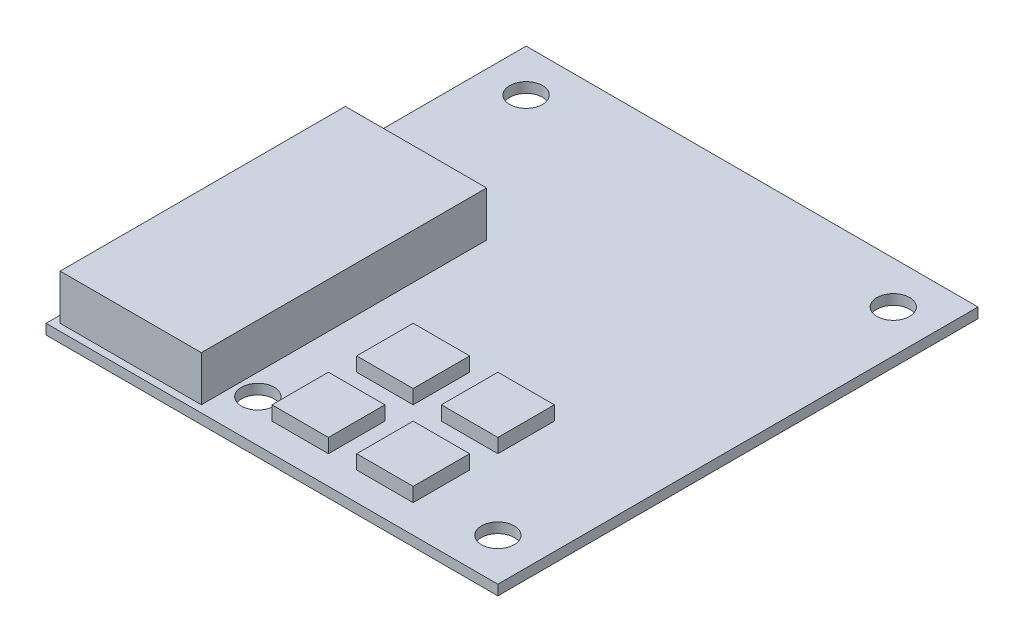
ISO-10303-21;
HEADER;
FILE_DESCRIPTION(('STEP AP214'),'2;1');
FILE_NAME('part.step','',(''),(''),'','','');
FILE_SCHEMA(('AUTOMOTIVE_DESIGN { 1 0 10303 214 1 1 1 1 }'));
ENDSEC;
DATA;
#1=APPLICATION_CONTEXT('core data for automotive mechanical design processes');
#2=APPLICATION_PROTOCOL_DEFINITION('international standard','automotive_design',2000,#1);
#3=PRODUCT_CONTEXT('',#1,'mechanical');
#4=PRODUCT('Part','Part','',(#3));
#5=PRODUCT_RELATED_PRODUCT_CATEGORY('part','',(#4));
#6=PRODUCT_DEFINITION_FORMATION('','',#4);
#7=PRODUCT_DEFINITION_CONTEXT('part definition',#1,'design');
#8=PRODUCT_DEFINITION('design','',#6,#7);
#9=PRODUCT_DEFINITION_SHAPE('','',#8);
#10=(LENGTH_UNIT() NAMED_UNIT(*) SI_UNIT(.MILLI.,.METRE.));
#11=(NAMED_UNIT(*) PLANE_ANGLE_UNIT() SI_UNIT($,.RADIAN.));
#12=(NAMED_UNIT(*) SI_UNIT($,.STERADIAN.) SOLID_ANGLE_UNIT());
#13=UNCERTAINTY_MEASURE_WITH_UNIT(LENGTH_MEASURE(1.E-05),#10,'distance_accuracy_value','');
#14=(GEOMETRIC_REPRESENTATION_CONTEXT(3) GLOBAL_UNCERTAINTY_ASSIGNED_CONTEXT((#13)) GLOBAL_UNIT_ASSIGNED_CONTEXT((#10,
#11,#12)) REPRESENTATION_CONTEXT('',''));
#15=CARTESIAN_POINT('',(0.,0.,0.));
#16=DIRECTION('',(0.,0.,1.));
#17=DIRECTION('',(1.,0.,0.));
#18=AXIS2_PLACEMENT_3D('',#15,#16,#17);
#19=CARTESIAN_POINT('',(0.,0.9144,0.));
#20=DIRECTION('',(0.,-1.,0.));
#21=DIRECTION('',(0.,0.,-1.));
#22=AXIS2_PLACEMENT_3D('',#19,#20,#21);
#23=PLANE('',#22);
#24=CARTESIAN_POINT('',(3.81,0.9144,-39.37));
#25=DIRECTION('',(0.,1.,0.));
#26=DIRECTION('',(0.,0.,1.));
#27=AXIS2_PLACEMENT_3D('',#24,#25,#26);
#28=CIRCLE('',#27,1.4732);
#29=CARTESIAN_POINT('',(3.81,0.9144,-37.8968));
#30=VERTEX_POINT('',#29);
#31=EDGE_CURVE('E396',#30,#30,#28,.T.);
#32=ORIENTED_EDGE('',*,*,#31,.F.);
#33=EDGE_LOOP('',(#32));
#34=FACE_BOUND('',#33,.T.);
#35=CARTESIAN_POINT('',(36.83,0.9144,-39.37));
#36=DIRECTION('',(0.,1.,0.));
#37=DIRECTION('',(0.,0.,1.));
#38=AXIS2_PLACEMENT_3D('',#35,#36,#37);
#39=CIRCLE('',#38,1.47319999999999);
#40=CARTESIAN_POINT('',(36.83,0.9144,-37.8968));
#41=VERTEX_POINT('',#40);
#42=EDGE_CURVE('E386',#41,#41,#39,.T.);
#43=ORIENTED_EDGE('',*,*,#42,.F.);
#44=EDGE_LOOP('',(#43));
#45=FACE_BOUND('',#44,.T.);
#46=CARTESIAN_POINT('',(36.83,0.9144,-3.81));
#47=DIRECTION('',(0.,1.,0.));
#48=DIRECTION('',(0.,0.,1.));
#49=AXIS2_PLACEMENT_3D('',#46,#47,#48);
#50=CIRCLE('',#49,1.47319999999999);
#51=CARTESIAN_POINT('',(36.83,0.9144,-2.33680000000001));
#52=VERTEX_POINT('',#51);
#53=EDGE_CURVE('E383',#52,#52,#50,.T.);
#54=ORIENTED_EDGE('',*,*,#53,.F.);
#55=EDGE_LOOP('',(#54));
#56=FACE_BOUND('',#55,.T.);
#57=CARTESIAN_POINT('',(15.24,0.9144,-3.81));
#58=DIRECTION('',(0.,1.,0.));
#59=DIRECTION('',(0.,0.,1.));
#60=AXIS2_PLACEMENT_3D('',#57,#58,#59);
#61=CIRCLE('',#60,1.4732);
#62=CARTESIAN_POINT('',(15.24,0.9144,-2.3368));
#63=VERTEX_POINT('',#62);
#64=EDGE_CURVE('E382',#63,#63,#61,.T.);
#65=ORIENTED_EDGE('',*,*,#64,.F.);
#66=EDGE_LOOP('',(#65));
#67=FACE_BOUND('',#66,.T.);
#68=DIRECTION('',(-1.,0.,0.));
#69=VECTOR('',#68,1.);
#70=CARTESIAN_POINT('',(17.78,0.9144,-7.62000000000001));
#71=LINE('',#70,#69);
#72=CARTESIAN_POINT('',(22.86,0.9144,-7.62000000000001));
#73=VERTEX_POINT('',#72);
#74=CARTESIAN_POINT('',(17.78,0.9144,-7.62000000000001));
#75=VERTEX_POINT('',#74);
#76=EDGE_CURVE('E217',#73,#75,#71,.T.);
#77=ORIENTED_EDGE('',*,*,#76,.F.);
#78=DIRECTION('',(0.,0.,-1.));
#79=VECTOR('',#78,1.);
#80=CARTESIAN_POINT('',(22.86,0.9144,-2.54000000000001));
#81=LINE('',#80,#79);
#82=CARTESIAN_POINT('',(22.86,0.9144,-2.54000000000001));
#83=VERTEX_POINT('',#82);
#84=EDGE_CURVE('E230',#83,#73,#81,.T.);
#85=ORIENTED_EDGE('',*,*,#84,.F.);
#86=DIRECTION('',(1.,0.,0.));
#87=VECTOR('',#86,1.);
#88=CARTESIAN_POINT('',(17.78,0.9144,-2.54000000000001));
#89=LINE('',#88,#87);
#90=CARTESIAN_POINT('',(17.78,0.9144,-2.54000000000001));
#91=VERTEX_POINT('',#90);
#92=EDGE_CURVE('E239',#91,#83,#89,.T.);
#93=ORIENTED_EDGE('',*,*,#92,.F.);
#94=DIRECTION('',(0.,0.,1.));
#95=VECTOR('',#94,1.);
#96=CARTESIAN_POINT('',(17.78,0.9144,-2.54000000000001));
#97=LINE('',#96,#95);
#98=EDGE_CURVE('E220',#75,#91,#97,.T.);
#99=ORIENTED_EDGE('',*,*,#98,.F.);
#100=EDGE_LOOP('',(#77,#85,#93,#99));
#101=FACE_BOUND('',#100,.T.);
#102=DIRECTION('',(-1.,0.,0.));
#103=VECTOR('',#102,1.);
#104=CARTESIAN_POINT('',(25.4,0.9144,-15.24));
#105=LINE('',#104,#103);
#106=CARTESIAN_POINT('',(30.48,0.9144,-15.24));
#107=VERTEX_POINT('',#106);
#108=CARTESIAN_POINT('',(25.4,0.9144,-15.24));
#109=VERTEX_POINT('',#108);
#110=EDGE_CURVE('E288',#107,#109,#105,.T.);
#111=ORIENTED_EDGE('',*,*,#110,.F.);
#112=DIRECTION('',(0.,0.,-1.));
#113=VECTOR('',#112,1.);
#114=CARTESIAN_POINT('',(30.48,0.9144,-10.16));
#115=LINE('',#114,#113);
#116=CARTESIAN_POINT('',(30.48,0.9144,-10.16));
#117=VERTEX_POINT('',#116);
#118=EDGE_CURVE('E293',#117,#107,#115,.T.);
#119=ORIENTED_EDGE('',*,*,#118,.F.);
#120=DIRECTION('',(1.,0.,0.));
#121=VECTOR('',#120,1.);
#122=CARTESIAN_POINT('',(25.4,0.9144,-10.16));
#123=LINE('',#122,#121);
#124=CARTESIAN_POINT('',(25.4,0.9144,-10.16));
#125=VERTEX_POINT('',#124);
#126=EDGE_CURVE('E305',#125,#117,#123,.T.);
#127=ORIENTED_EDGE('',*,*,#126,.F.);
#128=DIRECTION('',(0.,0.,1.));
#129=VECTOR('',#128,1.);
#130=CARTESIAN_POINT('',(25.4,0.9144,-10.16));
#131=LINE('',#130,#129);
#132=EDGE_CURVE('E302',#109,#125,#131,.T.);
#133=ORIENTED_EDGE('',*,*,#132,.F.);
#134=EDGE_LOOP('',(#111,#119,#127,#133));
#135=FACE_BOUND('',#134,.T.);
#136=DIRECTION('',(0.,0.,1.));
#137=VECTOR('',#136,1.);
#138=CARTESIAN_POINT('',(0.,0.9144,0.));
#139=LINE('',#138,#137);
#140=CARTESIAN_POINT('',(0.,0.9144,-43.18));
#141=VERTEX_POINT('',#140);
#142=CARTESIAN_POINT('',(0.,0.9144,0.));
#143=VERTEX_POINT('',#142);
#144=EDGE_CURVE('E355',#141,#143,#139,.T.);
#145=ORIENTED_EDGE('',*,*,#144,.T.);
#146=DIRECTION('',(1.,0.,0.));
#147=VECTOR('',#146,1.);
#148=CARTESIAN_POINT('',(0.,0.9144,0.));
#149=LINE('',#148,#147);
#150=CARTESIAN_POINT('',(40.64,0.9144,0.));
#151=VERTEX_POINT('',#150);
#152=EDGE_CURVE('E358',#143,#151,#149,.T.);
#153=ORIENTED_EDGE('',*,*,#152,.T.);
#154=DIRECTION('',(0.,0.,-1.));
#155=VECTOR('',#154,1.);
#156=CARTESIAN_POINT('',(40.64,0.9144,0.));
#157=LINE('',#156,#155);
#158=CARTESIAN_POINT('',(40.64,0.9144,-43.18));
#159=VERTEX_POINT('',#158);
#160=EDGE_CURVE('E361',#151,#159,#157,.T.);
#161=ORIENTED_EDGE('',*,*,#160,.T.);
#162=DIRECTION('',(-1.,0.,0.));
#163=VECTOR('',#162,1.);
#164=CARTESIAN_POINT('',(0.,0.9144,-43.18));
#165=LINE('',#164,#163);
#166=EDGE_CURVE('E363',#159,#141,#165,.T.);
#167=ORIENTED_EDGE('',*,*,#166,.T.);
#168=EDGE_LOOP('',(#145,#153,#161,#167));
#169=FACE_BOUND('',#168,.T.);
#170=DIRECTION('',(0.,0.,-1.));
#171=VECTOR('',#170,1.);
#172=CARTESIAN_POINT('',(22.86,0.9144,-10.16));
#173=LINE('',#172,#171);
#174=CARTESIAN_POINT('',(22.86,0.9144,-10.16));
#175=VERTEX_POINT('',#174);
#176=CARTESIAN_POINT('',(22.86,0.9144,-15.24));
#177=VERTEX_POINT('',#176);
#178=EDGE_CURVE('E321',#175,#177,#173,.T.);
#179=ORIENTED_EDGE('',*,*,#178,.F.);
#180=DIRECTION('',(1.,0.,0.));
#181=VECTOR('',#180,1.);
#182=CARTESIAN_POINT('',(17.78,0.9144,-10.16));
#183=LINE('',#182,#181);
#184=CARTESIAN_POINT('',(17.78,0.9144,-10.16));
#185=VERTEX_POINT('',#184);
#186=EDGE_CURVE('E326',#185,#175,#183,.T.);
#187=ORIENTED_EDGE('',*,*,#186,.F.);
#188=DIRECTION('',(0.,0.,1.));
#189=VECTOR('',#188,1.);
#190=CARTESIAN_POINT('',(17.78,0.9144,-10.16));
#191=LINE('',#190,#189);
#192=CARTESIAN_POINT('',(17.78,0.9144,-15.24));
#193=VERTEX_POINT('',#192);
#194=EDGE_CURVE('E338',#193,#185,#191,.T.);
#195=ORIENTED_EDGE('',*,*,#194,.F.);
#196=DIRECTION('',(-1.,0.,0.));
#197=VECTOR('',#196,1.);
#198=CARTESIAN_POINT('',(17.78,0.9144,-15.24));
#199=LINE('',#198,#197);
#200=EDGE_CURVE('E335',#177,#193,#199,.T.);
#201=ORIENTED_EDGE('',*,*,#200,.F.);
#202=EDGE_LOOP('',(#179,#187,#195,#201));
#203=FACE_BOUND('',#202,.T.);
#204=DIRECTION('',(-1.,0.,0.));
#205=VECTOR('',#204,1.);
#206=CARTESIAN_POINT('',(25.4,0.9144,-7.62000000000001));
#207=LINE('',#206,#205);
#208=CARTESIAN_POINT('',(30.48,0.9144,-7.62000000000001));
#209=VERTEX_POINT('',#208);
#210=CARTESIAN_POINT('',(25.4,0.9144,-7.62000000000001));
#211=VERTEX_POINT('',#210);
#212=EDGE_CURVE('E255',#209,#211,#207,.T.);
#213=ORIENTED_EDGE('',*,*,#212,.F.);
#214=DIRECTION('',(0.,0.,-1.));
#215=VECTOR('',#214,1.);
#216=CARTESIAN_POINT('',(30.48,0.9144,-2.54000000000001));
#217=LINE('',#216,#215);
#218=CARTESIAN_POINT('',(30.48,0.9144,-2.54000000000001));
#219=VERTEX_POINT('',#218);
#220=EDGE_CURVE('E260',#219,#209,#217,.T.);
#221=ORIENTED_EDGE('',*,*,#220,.F.);
#222=DIRECTION('',(1.,0.,0.));
#223=VECTOR('',#222,1.);
#224=CARTESIAN_POINT('',(25.4,0.9144,-2.54000000000001));
#225=LINE('',#224,#223);
#226=CARTESIAN_POINT('',(25.4,0.9144,-2.54000000000001));
#227=VERTEX_POINT('',#226);
#228=EDGE_CURVE('E272',#227,#219,#225,.T.);
#229=ORIENTED_EDGE('',*,*,#228,.F.);
#230=DIRECTION('',(0.,0.,1.));
#231=VECTOR('',#230,1.);
#232=CARTESIAN_POINT('',(25.4,0.9144,-2.54000000000001));
#233=LINE('',#232,#231);
#234=EDGE_CURVE('E269',#211,#227,#233,.T.);
#235=ORIENTED_EDGE('',*,*,#234,.F.);
#236=EDGE_LOOP('',(#213,#221,#229,#235));
#237=FACE_BOUND('',#236,.T.);
#238=DIRECTION('',(0.,0.,1.));
#239=VECTOR('',#238,1.);
#240=CARTESIAN_POINT('',(0.635,0.9144,-0.635));
#241=LINE('',#240,#239);
#242=CARTESIAN_POINT('',(0.635,0.9144,-26.289));
#243=VERTEX_POINT('',#242);
#244=CARTESIAN_POINT('',(0.635,0.9144,-0.635));
#245=VERTEX_POINT('',#244);
#246=EDGE_CURVE('E216',#243,#245,#241,.T.);
#247=ORIENTED_EDGE('',*,*,#246,.F.);
#248=DIRECTION('',(-1.,0.,0.));
#249=VECTOR('',#248,1.);
#250=CARTESIAN_POINT('',(0.635,0.9144,-26.289));
#251=LINE('',#250,#249);
#252=CARTESIAN_POINT('',(13.335,0.9144,-26.289));
#253=VERTEX_POINT('',#252);
#254=EDGE_CURVE('E213',#253,#243,#251,.T.);
#255=ORIENTED_EDGE('',*,*,#254,.F.);
#256=DIRECTION('',(0.,0.,-1.));
#257=VECTOR('',#256,1.);
#258=CARTESIAN_POINT('',(13.335,0.9144,-0.635));
#259=LINE('',#258,#257);
#260=CARTESIAN_POINT('',(13.335,0.9144,-0.635));
#261=VERTEX_POINT('',#260);
#262=EDGE_CURVE('E55',#261,#253,#259,.T.);
#263=ORIENTED_EDGE('',*,*,#262,.F.);
#264=DIRECTION('',(1.,0.,0.));
#265=VECTOR('',#264,1.);
#266=CARTESIAN_POINT('',(0.635,0.9144,-0.635));
#267=LINE('',#266,#265);
#268=EDGE_CURVE('E50',#245,#261,#267,.T.);
#269=ORIENTED_EDGE('',*,*,#268,.F.);
#270=EDGE_LOOP('',(#247,#255,#263,#269));
#271=FACE_BOUND('',#270,.T.);
#272=ADVANCED_FACE('F33',(#34,#45,#56,#67,#101,#135,#169,#203,#237,#271),#23,.F.);
#273=CARTESIAN_POINT('',(0.,0.9144,0.));
#274=DIRECTION('',(1.,0.,0.));
#275=DIRECTION('',(0.,0.,-1.));
#276=AXIS2_PLACEMENT_3D('',#273,#274,#275);
#277=PLANE('',#276);
#278=DIRECTION('',(0.,0.,1.));
#279=VECTOR('',#278,1.);
#280=CARTESIAN_POINT('',(0.,0.,0.));
#281=LINE('',#280,#279);
#282=CARTESIAN_POINT('',(0.,0.,-43.18));
#283=VERTEX_POINT('',#282);
#284=CARTESIAN_POINT('',(0.,0.,0.));
#285=VERTEX_POINT('',#284);
#286=EDGE_CURVE('E354',#283,#285,#281,.T.);
#287=ORIENTED_EDGE('',*,*,#286,.T.);
#288=DIRECTION('',(0.,-1.,0.));
#289=VECTOR('',#288,1.);
#290=CARTESIAN_POINT('',(0.,0.9144,0.));
#291=LINE('',#290,#289);
#292=EDGE_CURVE('E11',#143,#285,#291,.T.);
#293=ORIENTED_EDGE('',*,*,#292,.F.);
#294=ORIENTED_EDGE('',*,*,#144,.F.);
#295=DIRECTION('',(0.,-1.,0.));
#296=VECTOR('',#295,1.);
#297=CARTESIAN_POINT('',(0.,0.9144,-43.18));
#298=LINE('',#297,#296);
#299=EDGE_CURVE('E365',#141,#283,#298,.T.);
#300=ORIENTED_EDGE('',*,*,#299,.T.);
#301=EDGE_LOOP('',(#287,#293,#294,#300));
#302=FACE_BOUND('',#301,.T.);
#303=ADVANCED_FACE('F35',(#302),#277,.F.);
#304=CARTESIAN_POINT('',(0.,0.9144,0.));
#305=DIRECTION('',(0.,0.,-1.));
#306=DIRECTION('',(-1.,0.,0.));
#307=AXIS2_PLACEMENT_3D('',#304,#305,#306);
#308=PLANE('',#307);
#309=DIRECTION('',(1.,0.,0.));
#310=VECTOR('',#309,1.);
#311=CARTESIAN_POINT('',(0.,0.,0.));
#312=LINE('',#311,#310);
#313=CARTESIAN_POINT('',(40.64,0.,0.));
#314=VERTEX_POINT('',#313);
#315=EDGE_CURVE('E368',#285,#314,#312,.T.);
#316=ORIENTED_EDGE('',*,*,#315,.T.);
#317=DIRECTION('',(0.,-1.,0.));
#318=VECTOR('',#317,1.);
#319=CARTESIAN_POINT('',(40.64,0.9144,0.));
#320=LINE('',#319,#318);
#321=EDGE_CURVE('E42',#151,#314,#320,.T.);
#322=ORIENTED_EDGE('',*,*,#321,.F.);
#323=ORIENTED_EDGE('',*,*,#152,.F.);
#324=ORIENTED_EDGE('',*,*,#292,.T.);
#325=EDGE_LOOP('',(#316,#322,#323,#324));
#326=FACE_BOUND('',#325,.T.);
#327=ADVANCED_FACE('F432',(#326),#308,.F.);
#328=CARTESIAN_POINT('',(40.64,0.9144,0.));
#329=DIRECTION('',(-1.,0.,0.));
#330=DIRECTION('',(0.,0.,1.));
#331=AXIS2_PLACEMENT_3D('',#328,#329,#330);
#332=PLANE('',#331);
#333=DIRECTION('',(0.,0.,-1.));
#334=VECTOR('',#333,1.);
#335=CARTESIAN_POINT('',(40.64,0.,0.));
#336=LINE('',#335,#334);
#337=CARTESIAN_POINT('',(40.64,0.,-43.18));
#338=VERTEX_POINT('',#337);
#339=EDGE_CURVE('E370',#314,#338,#336,.T.);
#340=ORIENTED_EDGE('',*,*,#339,.T.);
#341=DIRECTION('',(0.,-1.,0.));
#342=VECTOR('',#341,1.);
#343=CARTESIAN_POINT('',(40.64,0.9144,-43.18));
#344=LINE('',#343,#342);
#345=EDGE_CURVE('E375',#159,#338,#344,.T.);
#346=ORIENTED_EDGE('',*,*,#345,.F.);
#347=ORIENTED_EDGE('',*,*,#160,.F.);
#348=ORIENTED_EDGE('',*,*,#321,.T.);
#349=EDGE_LOOP('',(#340,#346,#347,#348));
#350=FACE_BOUND('',#349,.T.);
#351=ADVANCED_FACE('F447',(#350),#332,.F.);
#352=CARTESIAN_POINT('',(0.,0.9144,-43.18));
#353=DIRECTION('',(0.,0.,1.));
#354=DIRECTION('',(1.,0.,0.));
#355=AXIS2_PLACEMENT_3D('',#352,#353,#354);
#356=PLANE('',#355);
#357=DIRECTION('',(-1.,0.,0.));
#358=VECTOR('',#357,1.);
#359=CARTESIAN_POINT('',(0.,0.,-43.18));
#360=LINE('',#359,#358);
#361=EDGE_CURVE('E359',#338,#283,#360,.T.);
#362=ORIENTED_EDGE('',*,*,#361,.T.);
#363=ORIENTED_EDGE('',*,*,#299,.F.);
#364=ORIENTED_EDGE('',*,*,#166,.F.);
#365=ORIENTED_EDGE('',*,*,#345,.T.);
#366=EDGE_LOOP('',(#362,#363,#364,#365));
#367=FACE_BOUND('',#366,.T.);
#368=ADVANCED_FACE('F443',(#367),#356,.F.);
#369=CARTESIAN_POINT('',(0.,0.,0.));
#370=DIRECTION('',(0.,-1.,0.));
#371=DIRECTION('',(0.,0.,-1.));
#372=AXIS2_PLACEMENT_3D('',#369,#370,#371);
#373=PLANE('',#372);
#374=CARTESIAN_POINT('',(3.81,0.,-39.37));
#375=DIRECTION('',(0.,-1.,0.));
#376=DIRECTION('',(0.,0.,-1.));
#377=AXIS2_PLACEMENT_3D('',#374,#375,#376);
#378=CIRCLE('',#377,1.4732);
#379=CARTESIAN_POINT('',(3.81,0.,-40.8432));
#380=VERTEX_POINT('',#379);
#381=EDGE_CURVE('E37',#380,#380,#378,.T.);
#382=ORIENTED_EDGE('',*,*,#381,.F.);
#383=EDGE_LOOP('',(#382));
#384=FACE_BOUND('',#383,.T.);
#385=CARTESIAN_POINT('',(36.83,0.,-39.37));
#386=DIRECTION('',(0.,-1.,0.));
#387=DIRECTION('',(0.,0.,-1.));
#388=AXIS2_PLACEMENT_3D('',#385,#386,#387);
#389=CIRCLE('',#388,1.47319999999999);
#390=CARTESIAN_POINT('',(36.83,0.,-40.8432));
#391=VERTEX_POINT('',#390);
#392=EDGE_CURVE('E384',#391,#391,#389,.T.);
#393=ORIENTED_EDGE('',*,*,#392,.F.);
#394=EDGE_LOOP('',(#393));
#395=FACE_BOUND('',#394,.T.);
#396=CARTESIAN_POINT('',(36.83,0.,-3.81));
#397=DIRECTION('',(0.,-1.,0.));
#398=DIRECTION('',(0.,0.,-1.));
#399=AXIS2_PLACEMENT_3D('',#396,#397,#398);
#400=CIRCLE('',#399,1.47319999999999);
#401=CARTESIAN_POINT('',(36.83,0.,-5.28319999999999));
#402=VERTEX_POINT('',#401);
#403=EDGE_CURVE('E380',#402,#402,#400,.T.);
#404=ORIENTED_EDGE('',*,*,#403,.F.);
#405=EDGE_LOOP('',(#404));
#406=FACE_BOUND('',#405,.T.);
#407=CARTESIAN_POINT('',(15.24,0.,-3.81));
#408=DIRECTION('',(0.,-1.,0.));
#409=DIRECTION('',(0.,0.,-1.));
#410=AXIS2_PLACEMENT_3D('',#407,#408,#409);
#411=CIRCLE('',#410,1.47319999999999);
#412=CARTESIAN_POINT('',(15.24,0.,-5.28319999999999));
#413=VERTEX_POINT('',#412);
#414=EDGE_CURVE('E401',#413,#413,#411,.T.);
#415=ORIENTED_EDGE('',*,*,#414,.F.);
#416=EDGE_LOOP('',(#415));
#417=FACE_BOUND('',#416,.T.);
#418=ORIENTED_EDGE('',*,*,#286,.F.);
#419=ORIENTED_EDGE('',*,*,#361,.F.);
#420=ORIENTED_EDGE('',*,*,#339,.F.);
#421=ORIENTED_EDGE('',*,*,#315,.F.);
#422=EDGE_LOOP('',(#418,#419,#420,#421));
#423=FACE_BOUND('',#422,.T.);
#424=ADVANCED_FACE('F440',(#384,#395,#406,#417,#423),#373,.T.);
#425=CARTESIAN_POINT('',(22.86,2.1844,-10.16));
#426=DIRECTION('',(-1.,0.,0.));
#427=DIRECTION('',(0.,0.,1.));
#428=AXIS2_PLACEMENT_3D('',#425,#426,#427);
#429=PLANE('',#428);
#430=ORIENTED_EDGE('',*,*,#178,.T.);
#431=DIRECTION('',(0.,-1.,0.));
#432=VECTOR('',#431,1.);
#433=CARTESIAN_POINT('',(22.86,2.1844,-15.24));
#434=LINE('',#433,#432);
#435=CARTESIAN_POINT('',(22.86,2.1844,-15.24));
#436=VERTEX_POINT('',#435);
#437=EDGE_CURVE('E351',#436,#177,#434,.T.);
#438=ORIENTED_EDGE('',*,*,#437,.F.);
#439=DIRECTION('',(0.,0.,-1.));
#440=VECTOR('',#439,1.);
#441=CARTESIAN_POINT('',(22.86,2.1844,-10.16));
#442=LINE('',#441,#440);
#443=CARTESIAN_POINT('',(22.86,2.1844,-10.16));
#444=VERTEX_POINT('',#443);
#445=EDGE_CURVE('E322',#444,#436,#442,.T.);
#446=ORIENTED_EDGE('',*,*,#445,.F.);
#447=DIRECTION('',(0.,-1.,0.));
#448=VECTOR('',#447,1.);
#449=CARTESIAN_POINT('',(22.86,2.1844,-10.16));
#450=LINE('',#449,#448);
#451=EDGE_CURVE('E332',#444,#175,#450,.T.);
#452=ORIENTED_EDGE('',*,*,#451,.T.);
#453=EDGE_LOOP('',(#430,#438,#446,#452));
#454=FACE_BOUND('',#453,.T.);
#455=ADVANCED_FACE('F438',(#454),#429,.F.);
#456=CARTESIAN_POINT('',(17.78,2.1844,-15.24));
#457=DIRECTION('',(0.,0.,1.));
#458=DIRECTION('',(1.,0.,0.));
#459=AXIS2_PLACEMENT_3D('',#456,#457,#458);
#460=PLANE('',#459);
#461=ORIENTED_EDGE('',*,*,#200,.T.);
#462=DIRECTION('',(0.,-1.,0.));
#463=VECTOR('',#462,1.);
#464=CARTESIAN_POINT('',(17.78,2.1844,-15.24));
#465=LINE('',#464,#463);
#466=CARTESIAN_POINT('',(17.78,2.1844,-15.24));
#467=VERTEX_POINT('',#466);
#468=EDGE_CURVE('E348',#467,#193,#465,.T.);
#469=ORIENTED_EDGE('',*,*,#468,.F.);
#470=DIRECTION('',(-1.,0.,0.));
#471=VECTOR('',#470,1.);
#472=CARTESIAN_POINT('',(17.78,2.1844,-15.24));
#473=LINE('',#472,#471);
#474=EDGE_CURVE('E325',#436,#467,#473,.T.);
#475=ORIENTED_EDGE('',*,*,#474,.F.);
#476=ORIENTED_EDGE('',*,*,#437,.T.);
#477=EDGE_LOOP('',(#461,#469,#475,#476));
#478=FACE_BOUND('',#477,.T.);
#479=ADVANCED_FACE('F526',(#478),#460,.F.);
#480=CARTESIAN_POINT('',(17.78,2.1844,-10.16));
#481=DIRECTION('',(1.,0.,0.));
#482=DIRECTION('',(0.,0.,-1.));
#483=AXIS2_PLACEMENT_3D('',#480,#481,#482);
#484=PLANE('',#483);
#485=ORIENTED_EDGE('',*,*,#194,.T.);
#486=DIRECTION('',(0.,-1.,0.));
#487=VECTOR('',#486,1.);
#488=CARTESIAN_POINT('',(17.78,2.1844,-10.16));
#489=LINE('',#488,#487);
#490=CARTESIAN_POINT('',(17.78,2.1844,-10.16));
#491=VERTEX_POINT('',#490);
#492=EDGE_CURVE('E345',#491,#185,#489,.T.);
#493=ORIENTED_EDGE('',*,*,#492,.F.);
#494=DIRECTION('',(0.,0.,1.));
#495=VECTOR('',#494,1.);
#496=CARTESIAN_POINT('',(17.78,2.1844,-10.16));
#497=LINE('',#496,#495);
#498=EDGE_CURVE('E328',#467,#491,#497,.T.);
#499=ORIENTED_EDGE('',*,*,#498,.F.);
#500=ORIENTED_EDGE('',*,*,#468,.T.);
#501=EDGE_LOOP('',(#485,#493,#499,#500));
#502=FACE_BOUND('',#501,.T.);
#503=ADVANCED_FACE('F523',(#502),#484,.F.);
#504=CARTESIAN_POINT('',(17.78,2.1844,-10.16));
#505=DIRECTION('',(0.,0.,-1.));
#506=DIRECTION('',(-1.,0.,0.));
#507=AXIS2_PLACEMENT_3D('',#504,#505,#506);
#508=PLANE('',#507);
#509=ORIENTED_EDGE('',*,*,#186,.T.);
#510=ORIENTED_EDGE('',*,*,#451,.F.);
#511=DIRECTION('',(1.,0.,0.));
#512=VECTOR('',#511,1.);
#513=CARTESIAN_POINT('',(17.78,2.1844,-10.16));
#514=LINE('',#513,#512);
#515=EDGE_CURVE('E330',#491,#444,#514,.T.);
#516=ORIENTED_EDGE('',*,*,#515,.F.);
#517=ORIENTED_EDGE('',*,*,#492,.T.);
#518=EDGE_LOOP('',(#509,#510,#516,#517));
#519=FACE_BOUND('',#518,.T.);
#520=ADVANCED_FACE('F519',(#519),#508,.F.);
#521=CARTESIAN_POINT('',(0.,2.1844,0.));
#522=DIRECTION('',(0.,-1.,0.));
#523=DIRECTION('',(0.,0.,-1.));
#524=AXIS2_PLACEMENT_3D('',#521,#522,#523);
#525=PLANE('',#524);
#526=ORIENTED_EDGE('',*,*,#445,.T.);
#527=ORIENTED_EDGE('',*,*,#474,.T.);
#528=ORIENTED_EDGE('',*,*,#498,.T.);
#529=ORIENTED_EDGE('',*,*,#515,.T.);
#530=EDGE_LOOP('',(#526,#527,#528,#529));
#531=FACE_BOUND('',#530,.T.);
#532=ADVANCED_FACE('F515',(#531),#525,.F.);
#533=CARTESIAN_POINT('',(25.4,2.1844,-15.24));
#534=DIRECTION('',(0.,0.,1.));
#535=DIRECTION('',(1.,0.,0.));
#536=AXIS2_PLACEMENT_3D('',#533,#534,#535);
#537=PLANE('',#536);
#538=ORIENTED_EDGE('',*,*,#110,.T.);
#539=DIRECTION('',(0.,-1.,0.));
#540=VECTOR('',#539,1.);
#541=CARTESIAN_POINT('',(25.4,2.1844,-15.24));
#542=LINE('',#541,#540);
#543=CARTESIAN_POINT('',(25.4,2.1844,-15.24));
#544=VERTEX_POINT('',#543);
#545=EDGE_CURVE('E318',#544,#109,#542,.T.);
#546=ORIENTED_EDGE('',*,*,#545,.F.);
#547=DIRECTION('',(-1.,0.,0.));
#548=VECTOR('',#547,1.);
#549=CARTESIAN_POINT('',(25.4,2.1844,-15.24));
#550=LINE('',#549,#548);
#551=CARTESIAN_POINT('',(30.48,2.1844,-15.24));
#552=VERTEX_POINT('',#551);
#553=EDGE_CURVE('E289',#552,#544,#550,.T.);
#554=ORIENTED_EDGE('',*,*,#553,.F.);
#555=DIRECTION('',(0.,-1.,0.));
#556=VECTOR('',#555,1.);
#557=CARTESIAN_POINT('',(30.48,2.1844,-15.24));
#558=LINE('',#557,#556);
#559=EDGE_CURVE('E299',#552,#107,#558,.T.);
#560=ORIENTED_EDGE('',*,*,#559,.T.);
#561=EDGE_LOOP('',(#538,#546,#554,#560));
#562=FACE_BOUND('',#561,.T.);
#563=ADVANCED_FACE('F511',(#562),#537,.F.);
#564=CARTESIAN_POINT('',(25.4,2.1844,-10.16));
#565=DIRECTION('',(1.,0.,0.));
#566=DIRECTION('',(0.,0.,-1.));
#567=AXIS2_PLACEMENT_3D('',#564,#565,#566);
#568=PLANE('',#567);
#569=ORIENTED_EDGE('',*,*,#132,.T.);
#570=DIRECTION('',(0.,-1.,0.));
#571=VECTOR('',#570,1.);
#572=CARTESIAN_POINT('',(25.4,2.1844,-10.16));
#573=LINE('',#572,#571);
#574=CARTESIAN_POINT('',(25.4,2.1844,-10.16));
#575=VERTEX_POINT('',#574);
#576=EDGE_CURVE('E315',#575,#125,#573,.T.);
#577=ORIENTED_EDGE('',*,*,#576,.F.);
#578=DIRECTION('',(0.,0.,1.));
#579=VECTOR('',#578,1.);
#580=CARTESIAN_POINT('',(25.4,2.1844,-10.16));
#581=LINE('',#580,#579);
#582=EDGE_CURVE('E292',#544,#575,#581,.T.);
#583=ORIENTED_EDGE('',*,*,#582,.F.);
#584=ORIENTED_EDGE('',*,*,#545,.T.);
#585=EDGE_LOOP('',(#569,#577,#583,#584));
#586=FACE_BOUND('',#585,.T.);
#587=ADVANCED_FACE('F507',(#586),#568,.F.);
#588=CARTESIAN_POINT('',(25.4,2.1844,-10.16));
#589=DIRECTION('',(0.,0.,-1.));
#590=DIRECTION('',(-1.,0.,0.));
#591=AXIS2_PLACEMENT_3D('',#588,#589,#590);
#592=PLANE('',#591);
#593=ORIENTED_EDGE('',*,*,#126,.T.);
#594=DIRECTION('',(0.,-1.,0.));
#595=VECTOR('',#594,1.);
#596=CARTESIAN_POINT('',(30.48,2.1844,-10.16));
#597=LINE('',#596,#595);
#598=CARTESIAN_POINT('',(30.48,2.1844,-10.16));
#599=VERTEX_POINT('',#598);
#600=EDGE_CURVE('E312',#599,#117,#597,.T.);
#601=ORIENTED_EDGE('',*,*,#600,.F.);
#602=DIRECTION('',(1.,0.,0.));
#603=VECTOR('',#602,1.);
#604=CARTESIAN_POINT('',(25.4,2.1844,-10.16));
#605=LINE('',#604,#603);
#606=EDGE_CURVE('E295',#575,#599,#605,.T.);
#607=ORIENTED_EDGE('',*,*,#606,.F.);
#608=ORIENTED_EDGE('',*,*,#576,.T.);
#609=EDGE_LOOP('',(#593,#601,#607,#608));
#610=FACE_BOUND('',#609,.T.);
#611=ADVANCED_FACE('F503',(#610),#592,.F.);
#612=CARTESIAN_POINT('',(30.48,2.1844,-10.16));
#613=DIRECTION('',(-1.,0.,0.));
#614=DIRECTION('',(0.,0.,1.));
#615=AXIS2_PLACEMENT_3D('',#612,#613,#614);
#616=PLANE('',#615);
#617=ORIENTED_EDGE('',*,*,#118,.T.);
#618=ORIENTED_EDGE('',*,*,#559,.F.);
#619=DIRECTION('',(0.,0.,-1.));
#620=VECTOR('',#619,1.);
#621=CARTESIAN_POINT('',(30.48,2.1844,-10.16));
#622=LINE('',#621,#620);
#623=EDGE_CURVE('E297',#599,#552,#622,.T.);
#624=ORIENTED_EDGE('',*,*,#623,.F.);
#625=ORIENTED_EDGE('',*,*,#600,.T.);
#626=EDGE_LOOP('',(#617,#618,#624,#625));
#627=FACE_BOUND('',#626,.T.);
#628=ADVANCED_FACE('F499',(#627),#616,.F.);
#629=CARTESIAN_POINT('',(0.,2.1844,0.));
#630=DIRECTION('',(0.,1.,0.));
#631=DIRECTION('',(0.,0.,1.));
#632=AXIS2_PLACEMENT_3D('',#629,#630,#631);
#633=PLANE('',#632);
#634=ORIENTED_EDGE('',*,*,#553,.T.);
#635=ORIENTED_EDGE('',*,*,#582,.T.);
#636=ORIENTED_EDGE('',*,*,#606,.T.);
#637=ORIENTED_EDGE('',*,*,#623,.T.);
#638=EDGE_LOOP('',(#634,#635,#636,#637));
#639=FACE_BOUND('',#638,.T.);
#640=ADVANCED_FACE('F493',(#639),#633,.T.);
#641=CARTESIAN_POINT('',(25.4,2.1844,-7.62000000000001));
#642=DIRECTION('',(0.,0.,1.));
#643=DIRECTION('',(1.,0.,0.));
#644=AXIS2_PLACEMENT_3D('',#641,#642,#643);
#645=PLANE('',#644);
#646=ORIENTED_EDGE('',*,*,#212,.T.);
#647=DIRECTION('',(0.,-1.,0.));
#648=VECTOR('',#647,1.);
#649=CARTESIAN_POINT('',(25.4,2.1844,-7.62000000000001));
#650=LINE('',#649,#648);
#651=CARTESIAN_POINT('',(25.4,2.1844,-7.62000000000001));
#652=VERTEX_POINT('',#651);
#653=EDGE_CURVE('E285',#652,#211,#650,.T.);
#654=ORIENTED_EDGE('',*,*,#653,.F.);
#655=DIRECTION('',(-1.,0.,0.));
#656=VECTOR('',#655,1.);
#657=CARTESIAN_POINT('',(25.4,2.1844,-7.62000000000001));
#658=LINE('',#657,#656);
#659=CARTESIAN_POINT('',(30.48,2.1844,-7.62000000000001));
#660=VERTEX_POINT('',#659);
#661=EDGE_CURVE('E256',#660,#652,#658,.T.);
#662=ORIENTED_EDGE('',*,*,#661,.F.);
#663=DIRECTION('',(0.,-1.,0.));
#664=VECTOR('',#663,1.);
#665=CARTESIAN_POINT('',(30.48,2.1844,-7.62000000000001));
#666=LINE('',#665,#664);
#667=EDGE_CURVE('E266',#660,#209,#666,.T.);
#668=ORIENTED_EDGE('',*,*,#667,.T.);
#669=EDGE_LOOP('',(#646,#654,#662,#668));
#670=FACE_BOUND('',#669,.T.);
#671=ADVANCED_FACE('F477',(#670),#645,.F.);
#672=CARTESIAN_POINT('',(25.4,2.1844,-2.54000000000001));
#673=DIRECTION('',(1.,0.,0.));
#674=DIRECTION('',(0.,0.,-1.));
#675=AXIS2_PLACEMENT_3D('',#672,#673,#674);
#676=PLANE('',#675);
#677=ORIENTED_EDGE('',*,*,#234,.T.);
#678=DIRECTION('',(0.,-1.,0.));
#679=VECTOR('',#678,1.);
#680=CARTESIAN_POINT('',(25.4,2.1844,-2.54000000000001));
#681=LINE('',#680,#679);
#682=CARTESIAN_POINT('',(25.4,2.1844,-2.54000000000001));
#683=VERTEX_POINT('',#682);
#684=EDGE_CURVE('E282',#683,#227,#681,.T.);
#685=ORIENTED_EDGE('',*,*,#684,.F.);
#686=DIRECTION('',(0.,0.,1.));
#687=VECTOR('',#686,1.);
#688=CARTESIAN_POINT('',(25.4,2.1844,-2.54000000000001));
#689=LINE('',#688,#687);
#690=EDGE_CURVE('E259',#652,#683,#689,.T.);
#691=ORIENTED_EDGE('',*,*,#690,.F.);
#692=ORIENTED_EDGE('',*,*,#653,.T.);
#693=EDGE_LOOP('',(#677,#685,#691,#692));
#694=FACE_BOUND('',#693,.T.);
#695=ADVANCED_FACE('F485',(#694),#676,.F.);
#696=CARTESIAN_POINT('',(25.4,2.1844,-2.54000000000001));
#697=DIRECTION('',(0.,0.,-1.));
#698=DIRECTION('',(-1.,0.,0.));
#699=AXIS2_PLACEMENT_3D('',#696,#697,#698);
#700=PLANE('',#699);
#701=ORIENTED_EDGE('',*,*,#228,.T.);
#702=DIRECTION('',(0.,-1.,0.));
#703=VECTOR('',#702,1.);
#704=CARTESIAN_POINT('',(30.48,2.1844,-2.54000000000001));
#705=LINE('',#704,#703);
#706=CARTESIAN_POINT('',(30.48,2.1844,-2.54000000000001));
#707=VERTEX_POINT('',#706);
#708=EDGE_CURVE('E279',#707,#219,#705,.T.);
#709=ORIENTED_EDGE('',*,*,#708,.F.);
#710=DIRECTION('',(1.,0.,0.));
#711=VECTOR('',#710,1.);
#712=CARTESIAN_POINT('',(25.4,2.1844,-2.54000000000001));
#713=LINE('',#712,#711);
#714=EDGE_CURVE('E262',#683,#707,#713,.T.);
#715=ORIENTED_EDGE('',*,*,#714,.F.);
#716=ORIENTED_EDGE('',*,*,#684,.T.);
#717=EDGE_LOOP('',(#701,#709,#715,#716));
#718=FACE_BOUND('',#717,.T.);
#719=ADVANCED_FACE('F483',(#718),#700,.F.);
#720=CARTESIAN_POINT('',(30.48,2.1844,-2.54000000000001));
#721=DIRECTION('',(-1.,0.,0.));
#722=DIRECTION('',(0.,0.,1.));
#723=AXIS2_PLACEMENT_3D('',#720,#721,#722);
#724=PLANE('',#723);
#725=ORIENTED_EDGE('',*,*,#220,.T.);
#726=ORIENTED_EDGE('',*,*,#667,.F.);
#727=DIRECTION('',(0.,0.,-1.));
#728=VECTOR('',#727,1.);
#729=CARTESIAN_POINT('',(30.48,2.1844,-2.54000000000001));
#730=LINE('',#729,#728);
#731=EDGE_CURVE('E264',#707,#660,#730,.T.);
#732=ORIENTED_EDGE('',*,*,#731,.F.);
#733=ORIENTED_EDGE('',*,*,#708,.T.);
#734=EDGE_LOOP('',(#725,#726,#732,#733));
#735=FACE_BOUND('',#734,.T.);
#736=ADVANCED_FACE('F473',(#735),#724,.F.);
#737=CARTESIAN_POINT('',(0.,2.1844,0.));
#738=DIRECTION('',(0.,1.,0.));
#739=DIRECTION('',(0.,0.,1.));
#740=AXIS2_PLACEMENT_3D('',#737,#738,#739);
#741=PLANE('',#740);
#742=ORIENTED_EDGE('',*,*,#661,.T.);
#743=ORIENTED_EDGE('',*,*,#690,.T.);
#744=ORIENTED_EDGE('',*,*,#714,.T.);
#745=ORIENTED_EDGE('',*,*,#731,.T.);
#746=EDGE_LOOP('',(#742,#743,#744,#745));
#747=FACE_BOUND('',#746,.T.);
#748=ADVANCED_FACE('F479',(#747),#741,.T.);
#749=CARTESIAN_POINT('',(17.78,2.1844,-7.62000000000001));
#750=DIRECTION('',(0.,0.,1.));
#751=DIRECTION('',(1.,0.,0.));
#752=AXIS2_PLACEMENT_3D('',#749,#750,#751);
#753=PLANE('',#752);
#754=ORIENTED_EDGE('',*,*,#76,.T.);
#755=DIRECTION('',(0.,-1.,0.));
#756=VECTOR('',#755,1.);
#757=CARTESIAN_POINT('',(17.78,2.1844,-7.62000000000001));
#758=LINE('',#757,#756);
#759=CARTESIAN_POINT('',(17.78,2.1844,-7.62000000000001));
#760=VERTEX_POINT('',#759);
#761=EDGE_CURVE('E252',#760,#75,#758,.T.);
#762=ORIENTED_EDGE('',*,*,#761,.F.);
#763=DIRECTION('',(-1.,0.,0.));
#764=VECTOR('',#763,1.);
#765=CARTESIAN_POINT('',(17.78,2.1844,-7.62000000000001));
#766=LINE('',#765,#764);
#767=CARTESIAN_POINT('',(22.86,2.1844,-7.62000000000001));
#768=VERTEX_POINT('',#767);
#769=EDGE_CURVE('E226',#768,#760,#766,.T.);
#770=ORIENTED_EDGE('',*,*,#769,.F.);
#771=DIRECTION('',(0.,-1.,0.));
#772=VECTOR('',#771,1.);
#773=CARTESIAN_POINT('',(22.86,2.1844,-7.62000000000001));
#774=LINE('',#773,#772);
#775=EDGE_CURVE('E235',#768,#73,#774,.T.);
#776=ORIENTED_EDGE('',*,*,#775,.T.);
#777=EDGE_LOOP('',(#754,#762,#770,#776));
#778=FACE_BOUND('',#777,.T.);
#779=ADVANCED_FACE('F646',(#778),#753,.F.);
#780=CARTESIAN_POINT('',(17.78,2.1844,-2.54000000000001));
#781=DIRECTION('',(1.,0.,0.));
#782=DIRECTION('',(0.,0.,-1.));
#783=AXIS2_PLACEMENT_3D('',#780,#781,#782);
#784=PLANE('',#783);
#785=ORIENTED_EDGE('',*,*,#98,.T.);
#786=DIRECTION('',(0.,-1.,0.));
#787=VECTOR('',#786,1.);
#788=CARTESIAN_POINT('',(17.78,2.1844,-2.54000000000001));
#789=LINE('',#788,#787);
#790=CARTESIAN_POINT('',(17.78,2.1844,-2.54000000000001));
#791=VERTEX_POINT('',#790);
#792=EDGE_CURVE('E249',#791,#91,#789,.T.);
#793=ORIENTED_EDGE('',*,*,#792,.F.);
#794=DIRECTION('',(0.,0.,1.));
#795=VECTOR('',#794,1.);
#796=CARTESIAN_POINT('',(17.78,2.1844,-2.54000000000001));
#797=LINE('',#796,#795);
#798=EDGE_CURVE('E229',#760,#791,#797,.T.);
#799=ORIENTED_EDGE('',*,*,#798,.F.);
#800=ORIENTED_EDGE('',*,*,#761,.T.);
#801=EDGE_LOOP('',(#785,#793,#799,#800));
#802=FACE_BOUND('',#801,.T.);
#803=ADVANCED_FACE('F654',(#802),#784,.F.);
#804=CARTESIAN_POINT('',(17.78,2.1844,-2.54000000000001));
#805=DIRECTION('',(0.,0.,-1.));
#806=DIRECTION('',(-1.,0.,0.));
#807=AXIS2_PLACEMENT_3D('',#804,#805,#806);
#808=PLANE('',#807);
#809=ORIENTED_EDGE('',*,*,#92,.T.);
#810=DIRECTION('',(0.,-1.,0.));
#811=VECTOR('',#810,1.);
#812=CARTESIAN_POINT('',(22.86,2.1844,-2.54000000000001));
#813=LINE('',#812,#811);
#814=CARTESIAN_POINT('',(22.86,2.1844,-2.54000000000001));
#815=VERTEX_POINT('',#814);
#816=EDGE_CURVE('E246',#815,#83,#813,.T.);
#817=ORIENTED_EDGE('',*,*,#816,.F.);
#818=DIRECTION('',(1.,0.,0.));
#819=VECTOR('',#818,1.);
#820=CARTESIAN_POINT('',(17.78,2.1844,-2.54000000000001));
#821=LINE('',#820,#819);
#822=EDGE_CURVE('E232',#791,#815,#821,.T.);
#823=ORIENTED_EDGE('',*,*,#822,.F.);
#824=ORIENTED_EDGE('',*,*,#792,.T.);
#825=EDGE_LOOP('',(#809,#817,#823,#824));
#826=FACE_BOUND('',#825,.T.);
#827=ADVANCED_FACE('F663',(#826),#808,.F.);
#828=CARTESIAN_POINT('',(22.86,2.1844,-2.54000000000001));
#829=DIRECTION('',(-1.,0.,0.));
#830=DIRECTION('',(0.,0.,1.));
#831=AXIS2_PLACEMENT_3D('',#828,#829,#830);
#832=PLANE('',#831);
#833=ORIENTED_EDGE('',*,*,#84,.T.);
#834=ORIENTED_EDGE('',*,*,#775,.F.);
#835=DIRECTION('',(0.,0.,-1.));
#836=VECTOR('',#835,1.);
#837=CARTESIAN_POINT('',(22.86,2.1844,-2.54000000000001));
#838=LINE('',#837,#836);
#839=EDGE_CURVE('E234',#815,#768,#838,.T.);
#840=ORIENTED_EDGE('',*,*,#839,.F.);
#841=ORIENTED_EDGE('',*,*,#816,.T.);
#842=EDGE_LOOP('',(#833,#834,#840,#841));
#843=FACE_BOUND('',#842,.T.);
#844=ADVANCED_FACE('F672',(#843),#832,.F.);
#845=CARTESIAN_POINT('',(0.,2.1844,0.));
#846=DIRECTION('',(0.,1.,0.));
#847=DIRECTION('',(0.,0.,1.));
#848=AXIS2_PLACEMENT_3D('',#845,#846,#847);
#849=PLANE('',#848);
#850=ORIENTED_EDGE('',*,*,#769,.T.);
#851=ORIENTED_EDGE('',*,*,#798,.T.);
#852=ORIENTED_EDGE('',*,*,#822,.T.);
#853=ORIENTED_EDGE('',*,*,#839,.T.);
#854=EDGE_LOOP('',(#850,#851,#852,#853));
#855=FACE_BOUND('',#854,.T.);
#856=ADVANCED_FACE('F681',(#855),#849,.T.);
#857=CARTESIAN_POINT('',(0.635,4.9784,-0.635));
#858=DIRECTION('',(1.,0.,0.));
#859=DIRECTION('',(0.,0.,-1.));
#860=AXIS2_PLACEMENT_3D('',#857,#858,#859);
#861=PLANE('',#860);
#862=ORIENTED_EDGE('',*,*,#246,.T.);
#863=DIRECTION('',(0.,-1.,0.));
#864=VECTOR('',#863,1.);
#865=CARTESIAN_POINT('',(0.635,4.9784,-0.635));
#866=LINE('',#865,#864);
#867=CARTESIAN_POINT('',(0.635,4.9784,-0.635));
#868=VERTEX_POINT('',#867);
#869=EDGE_CURVE('E197',#868,#245,#866,.T.);
#870=ORIENTED_EDGE('',*,*,#869,.F.);
#871=DIRECTION('',(0.,0.,1.));
#872=VECTOR('',#871,1.);
#873=CARTESIAN_POINT('',(0.635,4.9784,-0.635));
#874=LINE('',#873,#872);
#875=CARTESIAN_POINT('',(0.635,4.9784,-26.289));
#876=VERTEX_POINT('',#875);
#877=EDGE_CURVE('E204',#876,#868,#874,.T.);
#878=ORIENTED_EDGE('',*,*,#877,.F.);
#879=DIRECTION('',(0.,-1.,0.));
#880=VECTOR('',#879,1.);
#881=CARTESIAN_POINT('',(0.635,4.9784,-26.289));
#882=LINE('',#881,#880);
#883=EDGE_CURVE('E406',#876,#243,#882,.T.);
#884=ORIENTED_EDGE('',*,*,#883,.T.);
#885=EDGE_LOOP('',(#862,#870,#878,#884));
#886=FACE_BOUND('',#885,.T.);
#887=ADVANCED_FACE('F215',(#886),#861,.F.);
#888=CARTESIAN_POINT('',(0.635,4.9784,-0.635));
#889=DIRECTION('',(0.,0.,-1.));
#890=DIRECTION('',(-1.,0.,0.));
#891=AXIS2_PLACEMENT_3D('',#888,#889,#890);
#892=PLANE('',#891);
#893=ORIENTED_EDGE('',*,*,#268,.T.);
#894=DIRECTION('',(0.,-1.,0.));
#895=VECTOR('',#894,1.);
#896=CARTESIAN_POINT('',(13.335,4.9784,-0.635));
#897=LINE('',#896,#895);
#898=CARTESIAN_POINT('',(13.335,4.9784,-0.635));
#899=VERTEX_POINT('',#898);
#900=EDGE_CURVE('E200',#899,#261,#897,.T.);
#901=ORIENTED_EDGE('',*,*,#900,.F.);
#902=DIRECTION('',(1.,0.,0.));
#903=VECTOR('',#902,1.);
#904=CARTESIAN_POINT('',(0.635,4.9784,-0.635));
#905=LINE('',#904,#903);
#906=EDGE_CURVE('E193',#868,#899,#905,.T.);
#907=ORIENTED_EDGE('',*,*,#906,.F.);
#908=ORIENTED_EDGE('',*,*,#869,.T.);
#909=EDGE_LOOP('',(#893,#901,#907,#908));
#910=FACE_BOUND('',#909,.T.);
#911=ADVANCED_FACE('F195',(#910),#892,.F.);
#912=CARTESIAN_POINT('',(13.335,4.9784,-0.635));
#913=DIRECTION('',(-1.,0.,0.));
#914=DIRECTION('',(0.,0.,1.));
#915=AXIS2_PLACEMENT_3D('',#912,#913,#914);
#916=PLANE('',#915);
#917=ORIENTED_EDGE('',*,*,#262,.T.);
#918=DIRECTION('',(0.,-1.,0.));
#919=VECTOR('',#918,1.);
#920=CARTESIAN_POINT('',(13.335,4.9784,-26.289));
#921=LINE('',#920,#919);
#922=CARTESIAN_POINT('',(13.335,4.9784,-26.289));
#923=VERTEX_POINT('',#922);
#924=EDGE_CURVE('E222',#923,#253,#921,.T.);
#925=ORIENTED_EDGE('',*,*,#924,.F.);
#926=DIRECTION('',(0.,0.,-1.));
#927=VECTOR('',#926,1.);
#928=CARTESIAN_POINT('',(13.335,4.9784,-0.635));
#929=LINE('',#928,#927);
#930=EDGE_CURVE('E203',#899,#923,#929,.T.);
#931=ORIENTED_EDGE('',*,*,#930,.F.);
#932=ORIENTED_EDGE('',*,*,#900,.T.);
#933=EDGE_LOOP('',(#917,#925,#931,#932));
#934=FACE_BOUND('',#933,.T.);
#935=ADVANCED_FACE('F417',(#934),#916,.F.);
#936=CARTESIAN_POINT('',(0.635,4.9784,-26.289));
#937=DIRECTION('',(0.,0.,1.));
#938=DIRECTION('',(1.,0.,0.));
#939=AXIS2_PLACEMENT_3D('',#936,#937,#938);
#940=PLANE('',#939);
#941=ORIENTED_EDGE('',*,*,#254,.T.);
#942=ORIENTED_EDGE('',*,*,#883,.F.);
#943=DIRECTION('',(-1.,0.,0.));
#944=VECTOR('',#943,1.);
#945=CARTESIAN_POINT('',(0.635,4.9784,-26.289));
#946=LINE('',#945,#944);
#947=EDGE_CURVE('E209',#923,#876,#946,.T.);
#948=ORIENTED_EDGE('',*,*,#947,.F.);
#949=ORIENTED_EDGE('',*,*,#924,.T.);
#950=EDGE_LOOP('',(#941,#942,#948,#949));
#951=FACE_BOUND('',#950,.T.);
#952=ADVANCED_FACE('F415',(#951),#940,.F.);
#953=CARTESIAN_POINT('',(0.,4.9784,0.));
#954=DIRECTION('',(0.,-1.,0.));
#955=DIRECTION('',(0.,0.,-1.));
#956=AXIS2_PLACEMENT_3D('',#953,#954,#955);
#957=PLANE('',#956);
#958=ORIENTED_EDGE('',*,*,#877,.T.);
#959=ORIENTED_EDGE('',*,*,#906,.T.);
#960=ORIENTED_EDGE('',*,*,#930,.T.);
#961=ORIENTED_EDGE('',*,*,#947,.T.);
#962=EDGE_LOOP('',(#958,#959,#960,#961));
#963=FACE_BOUND('',#962,.T.);
#964=ADVANCED_FACE('F207',(#963),#957,.F.);
#965=CARTESIAN_POINT('',(15.24,0.9144,-3.81));
#966=DIRECTION('',(0.,1.,0.));
#967=DIRECTION('',(0.,0.,1.));
#968=AXIS2_PLACEMENT_3D('',#965,#966,#967);
#969=CYLINDRICAL_SURFACE('',#968,1.47319999999999);
#970=ORIENTED_EDGE('',*,*,#414,.T.);
#971=EDGE_LOOP('',(#970));
#972=FACE_BOUND('',#971,.T.);
#973=ORIENTED_EDGE('',*,*,#64,.T.);
#974=EDGE_LOOP('',(#973));
#975=FACE_BOUND('',#974,.T.);
#976=ADVANCED_FACE('F723',(#972,#975),#969,.F.);
#977=CARTESIAN_POINT('',(36.83,0.9144,-3.81));
#978=DIRECTION('',(0.,1.,0.));
#979=DIRECTION('',(0.,0.,1.));
#980=AXIS2_PLACEMENT_3D('',#977,#978,#979);
#981=CYLINDRICAL_SURFACE('',#980,1.47319999999999);
#982=ORIENTED_EDGE('',*,*,#403,.T.);
#983=EDGE_LOOP('',(#982));
#984=FACE_BOUND('',#983,.T.);
#985=ORIENTED_EDGE('',*,*,#53,.T.);
#986=EDGE_LOOP('',(#985));
#987=FACE_BOUND('',#986,.T.);
#988=ADVANCED_FACE('F730',(#984,#987),#981,.F.);
#989=CARTESIAN_POINT('',(36.83,0.9144,-39.37));
#990=DIRECTION('',(0.,1.,0.));
#991=DIRECTION('',(0.,0.,1.));
#992=AXIS2_PLACEMENT_3D('',#989,#990,#991);
#993=CYLINDRICAL_SURFACE('',#992,1.47319999999999);
#994=ORIENTED_EDGE('',*,*,#392,.T.);
#995=EDGE_LOOP('',(#994));
#996=FACE_BOUND('',#995,.T.);
#997=ORIENTED_EDGE('',*,*,#42,.T.);
#998=EDGE_LOOP('',(#997));
#999=FACE_BOUND('',#998,.T.);
#1000=ADVANCED_FACE('F739',(#996,#999),#993,.F.);
#1001=CARTESIAN_POINT('',(3.81,0.9144,-39.37));
#1002=DIRECTION('',(0.,1.,0.));
#1003=DIRECTION('',(0.,0.,1.));
#1004=AXIS2_PLACEMENT_3D('',#1001,#1002,#1003);
#1005=CYLINDRICAL_SURFACE('',#1004,1.4732);
#1006=ORIENTED_EDGE('',*,*,#381,.T.);
#1007=EDGE_LOOP('',(#1006));
#1008=FACE_BOUND('',#1007,.T.);
#1009=ORIENTED_EDGE('',*,*,#31,.T.);
#1010=EDGE_LOOP('',(#1009));
#1011=FACE_BOUND('',#1010,.T.);
#1012=ADVANCED_FACE('F748',(#1008,#1011),#1005,.F.);
#1013=CLOSED_SHELL('',(#272,#303,#327,#351,#368,#424,#455,#479,#503,#520,#532,#563,#587,#611,
#628,#640,#671,#695,#719,#736,#748,#779,#803,#827,#844,#856,#887,#911,#935,#952,#964,#976,#988,
#1000,#1012));
#1014=MANIFOLD_SOLID_BREP('B2',#1013);
#1015=ADVANCED_BREP_SHAPE_REPRESENTATION('',(#18,#1014),#14);
#1016=SHAPE_DEFINITION_REPRESENTATION(#9,#1015);
ENDSEC;
END-ISO-10303-21;
